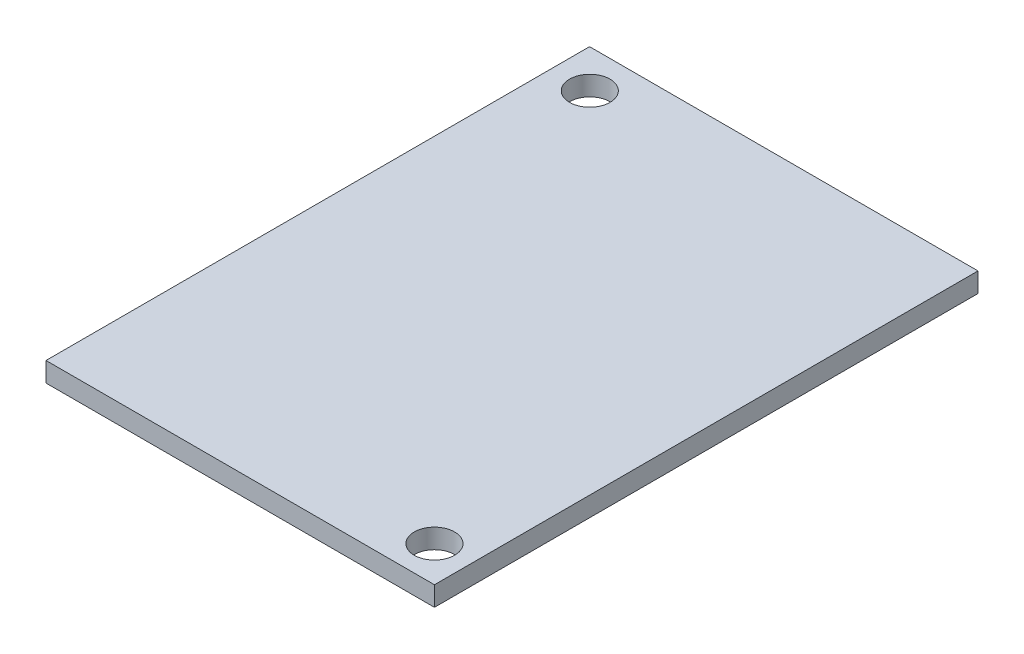
ISO-10303-21;
HEADER;
FILE_DESCRIPTION(('STEP AP214'),'2;1');
FILE_NAME('part.step','',(''),(''),'','','');
FILE_SCHEMA(('AUTOMOTIVE_DESIGN { 1 0 10303 214 1 1 1 1 }'));
ENDSEC;
DATA;
#1=APPLICATION_CONTEXT('core data for automotive mechanical design processes');
#2=APPLICATION_PROTOCOL_DEFINITION('international standard','automotive_design',2000,#1);
#3=PRODUCT_CONTEXT('',#1,'mechanical');
#4=PRODUCT('Part','Part','',(#3));
#5=PRODUCT_RELATED_PRODUCT_CATEGORY('part','',(#4));
#6=PRODUCT_DEFINITION_FORMATION('','',#4);
#7=PRODUCT_DEFINITION_CONTEXT('part definition',#1,'design');
#8=PRODUCT_DEFINITION('design','',#6,#7);
#9=PRODUCT_DEFINITION_SHAPE('','',#8);
#10=(LENGTH_UNIT() NAMED_UNIT(*) SI_UNIT(.MILLI.,.METRE.));
#11=(NAMED_UNIT(*) PLANE_ANGLE_UNIT() SI_UNIT($,.RADIAN.));
#12=(NAMED_UNIT(*) SI_UNIT($,.STERADIAN.) SOLID_ANGLE_UNIT());
#13=UNCERTAINTY_MEASURE_WITH_UNIT(LENGTH_MEASURE(1.E-05),#10,'distance_accuracy_value','');
#14=(GEOMETRIC_REPRESENTATION_CONTEXT(3) GLOBAL_UNCERTAINTY_ASSIGNED_CONTEXT((#13)) GLOBAL_UNIT_ASSIGNED_CONTEXT((#10,
#11,#12)) REPRESENTATION_CONTEXT('',''));
#15=CARTESIAN_POINT('',(0.,0.,0.));
#16=DIRECTION('',(0.,0.,1.));
#17=DIRECTION('',(1.,0.,0.));
#18=AXIS2_PLACEMENT_3D('',#15,#16,#17);
#19=CARTESIAN_POINT('',(0.,1.6,0.));
#20=DIRECTION('',(1.,0.,0.));
#21=DIRECTION('',(0.,0.,-1.));
#22=AXIS2_PLACEMENT_3D('',#19,#20,#21);
#23=PLANE('',#22);
#24=DIRECTION('',(0.,0.,1.));
#25=VECTOR('',#24,1.);
#26=CARTESIAN_POINT('',(0.,0.,0.));
#27=LINE('',#26,#25);
#28=CARTESIAN_POINT('',(0.,0.,-44.4));
#29=VERTEX_POINT('',#28);
#30=CARTESIAN_POINT('',(0.,0.,0.));
#31=VERTEX_POINT('',#30);
#32=EDGE_CURVE('E96',#29,#31,#27,.T.);
#33=ORIENTED_EDGE('',*,*,#32,.T.);
#34=DIRECTION('',(0.,-1.,0.));
#35=VECTOR('',#34,1.);
#36=CARTESIAN_POINT('',(0.,1.6,0.));
#37=LINE('',#36,#35);
#38=CARTESIAN_POINT('',(0.,1.6,0.));
#39=VERTEX_POINT('',#38);
#40=EDGE_CURVE('E11',#39,#31,#37,.T.);
#41=ORIENTED_EDGE('',*,*,#40,.F.);
#42=DIRECTION('',(0.,0.,1.));
#43=VECTOR('',#42,1.);
#44=CARTESIAN_POINT('',(0.,1.6,0.));
#45=LINE('',#44,#43);
#46=CARTESIAN_POINT('',(0.,1.6,-44.4));
#47=VERTEX_POINT('',#46);
#48=EDGE_CURVE('E84',#47,#39,#45,.T.);
#49=ORIENTED_EDGE('',*,*,#48,.F.);
#50=DIRECTION('',(0.,-1.,0.));
#51=VECTOR('',#50,1.);
#52=CARTESIAN_POINT('',(0.,1.6,-44.4));
#53=LINE('',#52,#51);
#54=EDGE_CURVE('E92',#47,#29,#53,.T.);
#55=ORIENTED_EDGE('',*,*,#54,.T.);
#56=EDGE_LOOP('',(#33,#41,#49,#55));
#57=FACE_BOUND('',#56,.T.);
#58=ADVANCED_FACE('F33',(#57),#23,.F.);
#59=CARTESIAN_POINT('',(0.,1.6,0.));
#60=DIRECTION('',(0.,0.,-1.));
#61=DIRECTION('',(-1.,0.,0.));
#62=AXIS2_PLACEMENT_3D('',#59,#60,#61);
#63=PLANE('',#62);
#64=DIRECTION('',(1.,0.,0.));
#65=VECTOR('',#64,1.);
#66=CARTESIAN_POINT('',(0.,0.,0.));
#67=LINE('',#66,#65);
#68=CARTESIAN_POINT('',(31.73,0.,0.));
#69=VERTEX_POINT('',#68);
#70=EDGE_CURVE('E88',#31,#69,#67,.T.);
#71=ORIENTED_EDGE('',*,*,#70,.T.);
#72=DIRECTION('',(0.,-1.,0.));
#73=VECTOR('',#72,1.);
#74=CARTESIAN_POINT('',(31.73,1.6,0.));
#75=LINE('',#74,#73);
#76=CARTESIAN_POINT('',(31.73,1.6,0.));
#77=VERTEX_POINT('',#76);
#78=EDGE_CURVE('E41',#77,#69,#75,.T.);
#79=ORIENTED_EDGE('',*,*,#78,.F.);
#80=DIRECTION('',(1.,0.,0.));
#81=VECTOR('',#80,1.);
#82=CARTESIAN_POINT('',(0.,1.6,0.));
#83=LINE('',#82,#81);
#84=EDGE_CURVE('E79',#39,#77,#83,.T.);
#85=ORIENTED_EDGE('',*,*,#84,.F.);
#86=ORIENTED_EDGE('',*,*,#40,.T.);
#87=EDGE_LOOP('',(#71,#79,#85,#86));
#88=FACE_BOUND('',#87,.T.);
#89=ADVANCED_FACE('F87',(#88),#63,.F.);
#90=CARTESIAN_POINT('',(31.73,1.6,0.));
#91=DIRECTION('',(-1.,0.,0.));
#92=DIRECTION('',(0.,0.,1.));
#93=AXIS2_PLACEMENT_3D('',#90,#91,#92);
#94=PLANE('',#93);
#95=DIRECTION('',(0.,0.,-1.));
#96=VECTOR('',#95,1.);
#97=CARTESIAN_POINT('',(31.73,0.,0.));
#98=LINE('',#97,#96);
#99=CARTESIAN_POINT('',(31.73,0.,-44.4));
#100=VERTEX_POINT('',#99);
#101=EDGE_CURVE('E66',#69,#100,#98,.T.);
#102=ORIENTED_EDGE('',*,*,#101,.T.);
#103=DIRECTION('',(0.,-1.,0.));
#104=VECTOR('',#103,1.);
#105=CARTESIAN_POINT('',(31.73,1.6,-44.4));
#106=LINE('',#105,#104);
#107=CARTESIAN_POINT('',(31.73,1.6,-44.4));
#108=VERTEX_POINT('',#107);
#109=EDGE_CURVE('E89',#108,#100,#106,.T.);
#110=ORIENTED_EDGE('',*,*,#109,.F.);
#111=DIRECTION('',(0.,0.,-1.));
#112=VECTOR('',#111,1.);
#113=CARTESIAN_POINT('',(31.73,1.6,0.));
#114=LINE('',#113,#112);
#115=EDGE_CURVE('E82',#77,#108,#114,.T.);
#116=ORIENTED_EDGE('',*,*,#115,.F.);
#117=ORIENTED_EDGE('',*,*,#78,.T.);
#118=EDGE_LOOP('',(#102,#110,#116,#117));
#119=FACE_BOUND('',#118,.T.);
#120=ADVANCED_FACE('F90',(#119),#94,.F.);
#121=CARTESIAN_POINT('',(0.,1.6,-44.4));
#122=DIRECTION('',(0.,0.,1.));
#123=DIRECTION('',(1.,0.,0.));
#124=AXIS2_PLACEMENT_3D('',#121,#122,#123);
#125=PLANE('',#124);
#126=DIRECTION('',(-1.,0.,0.));
#127=VECTOR('',#126,1.);
#128=CARTESIAN_POINT('',(0.,0.,-44.4));
#129=LINE('',#128,#127);
#130=EDGE_CURVE('E72',#100,#29,#129,.T.);
#131=ORIENTED_EDGE('',*,*,#130,.T.);
#132=ORIENTED_EDGE('',*,*,#54,.F.);
#133=DIRECTION('',(-1.,0.,0.));
#134=VECTOR('',#133,1.);
#135=CARTESIAN_POINT('',(0.,1.6,-44.4));
#136=LINE('',#135,#134);
#137=EDGE_CURVE('E49',#108,#47,#136,.T.);
#138=ORIENTED_EDGE('',*,*,#137,.F.);
#139=ORIENTED_EDGE('',*,*,#109,.T.);
#140=EDGE_LOOP('',(#131,#132,#138,#139));
#141=FACE_BOUND('',#140,.T.);
#142=ADVANCED_FACE('F104',(#141),#125,.F.);
#143=CARTESIAN_POINT('',(0.,1.6,0.));
#144=DIRECTION('',(0.,-1.,0.));
#145=DIRECTION('',(0.,0.,-1.));
#146=AXIS2_PLACEMENT_3D('',#143,#144,#145);
#147=PLANE('',#146);
#148=CARTESIAN_POINT('',(28.82,1.6,-2.91));
#149=DIRECTION('',(0.,1.,0.));
#150=DIRECTION('',(0.,0.,1.));
#151=AXIS2_PLACEMENT_3D('',#148,#149,#150);
#152=CIRCLE('',#151,1.65);
#153=CARTESIAN_POINT('',(28.82,1.6,-1.26));
#154=VERTEX_POINT('',#153);
#155=EDGE_CURVE('E116',#154,#154,#152,.T.);
#156=ORIENTED_EDGE('',*,*,#155,.F.);
#157=EDGE_LOOP('',(#156));
#158=FACE_BOUND('',#157,.T.);
#159=CARTESIAN_POINT('',(3.12999999999999,1.6,-41.29));
#160=DIRECTION('',(0.,1.,0.));
#161=DIRECTION('',(0.,0.,1.));
#162=AXIS2_PLACEMENT_3D('',#159,#160,#161);
#163=CIRCLE('',#162,1.65);
#164=CARTESIAN_POINT('',(3.12999999999999,1.6,-39.64));
#165=VERTEX_POINT('',#164);
#166=EDGE_CURVE('E110',#165,#165,#163,.T.);
#167=ORIENTED_EDGE('',*,*,#166,.F.);
#168=EDGE_LOOP('',(#167));
#169=FACE_BOUND('',#168,.T.);
#170=ORIENTED_EDGE('',*,*,#48,.T.);
#171=ORIENTED_EDGE('',*,*,#84,.T.);
#172=ORIENTED_EDGE('',*,*,#115,.T.);
#173=ORIENTED_EDGE('',*,*,#137,.T.);
#174=EDGE_LOOP('',(#170,#171,#172,#173));
#175=FACE_BOUND('',#174,.T.);
#176=ADVANCED_FACE('F80',(#158,#169,#175),#147,.F.);
#177=CARTESIAN_POINT('',(0.,0.,0.));
#178=DIRECTION('',(0.,-1.,0.));
#179=DIRECTION('',(0.,0.,-1.));
#180=AXIS2_PLACEMENT_3D('',#177,#178,#179);
#181=PLANE('',#180);
#182=CARTESIAN_POINT('',(28.82,0.,-2.91));
#183=DIRECTION('',(0.,1.,0.));
#184=DIRECTION('',(0.,0.,1.));
#185=AXIS2_PLACEMENT_3D('',#182,#183,#184);
#186=CIRCLE('',#185,1.65);
#187=CARTESIAN_POINT('',(28.82,0.,-1.26));
#188=VERTEX_POINT('',#187);
#189=EDGE_CURVE('E113',#188,#188,#186,.T.);
#190=ORIENTED_EDGE('',*,*,#189,.T.);
#191=EDGE_LOOP('',(#190));
#192=FACE_BOUND('',#191,.T.);
#193=CARTESIAN_POINT('',(3.12999999999999,0.,-41.29));
#194=DIRECTION('',(0.,1.,0.));
#195=DIRECTION('',(0.,0.,1.));
#196=AXIS2_PLACEMENT_3D('',#193,#194,#195);
#197=CIRCLE('',#196,1.65);
#198=CARTESIAN_POINT('',(3.12999999999999,0.,-39.64));
#199=VERTEX_POINT('',#198);
#200=EDGE_CURVE('E99',#199,#199,#197,.T.);
#201=ORIENTED_EDGE('',*,*,#200,.T.);
#202=EDGE_LOOP('',(#201));
#203=FACE_BOUND('',#202,.T.);
#204=ORIENTED_EDGE('',*,*,#32,.F.);
#205=ORIENTED_EDGE('',*,*,#130,.F.);
#206=ORIENTED_EDGE('',*,*,#101,.F.);
#207=ORIENTED_EDGE('',*,*,#70,.F.);
#208=EDGE_LOOP('',(#204,#205,#206,#207));
#209=FACE_BOUND('',#208,.T.);
#210=ADVANCED_FACE('F107',(#192,#203,#209),#181,.T.);
#211=CARTESIAN_POINT('',(3.12999999999999,0.,-41.29));
#212=DIRECTION('',(0.,1.,0.));
#213=DIRECTION('',(0.,0.,1.));
#214=AXIS2_PLACEMENT_3D('',#211,#212,#213);
#215=CYLINDRICAL_SURFACE('',#214,1.65);
#216=ORIENTED_EDGE('',*,*,#200,.F.);
#217=EDGE_LOOP('',(#216));
#218=FACE_BOUND('',#217,.T.);
#219=ORIENTED_EDGE('',*,*,#166,.T.);
#220=EDGE_LOOP('',(#219));
#221=FACE_BOUND('',#220,.T.);
#222=ADVANCED_FACE('F127',(#218,#221),#215,.F.);
#223=CARTESIAN_POINT('',(28.82,0.,-2.91));
#224=DIRECTION('',(0.,1.,0.));
#225=DIRECTION('',(0.,0.,1.));
#226=AXIS2_PLACEMENT_3D('',#223,#224,#225);
#227=CYLINDRICAL_SURFACE('',#226,1.65);
#228=ORIENTED_EDGE('',*,*,#189,.F.);
#229=EDGE_LOOP('',(#228));
#230=FACE_BOUND('',#229,.T.);
#231=ORIENTED_EDGE('',*,*,#155,.T.);
#232=EDGE_LOOP('',(#231));
#233=FACE_BOUND('',#232,.T.);
#234=ADVANCED_FACE('F124',(#230,#233),#227,.F.);
#235=CLOSED_SHELL('',(#58,#89,#120,#142,#176,#210,#222,#234));
#236=MANIFOLD_SOLID_BREP('B2',#235);
#237=ADVANCED_BREP_SHAPE_REPRESENTATION('',(#18,#236),#14);
#238=SHAPE_DEFINITION_REPRESENTATION(#9,#237);
ENDSEC;
END-ISO-10303-21;
